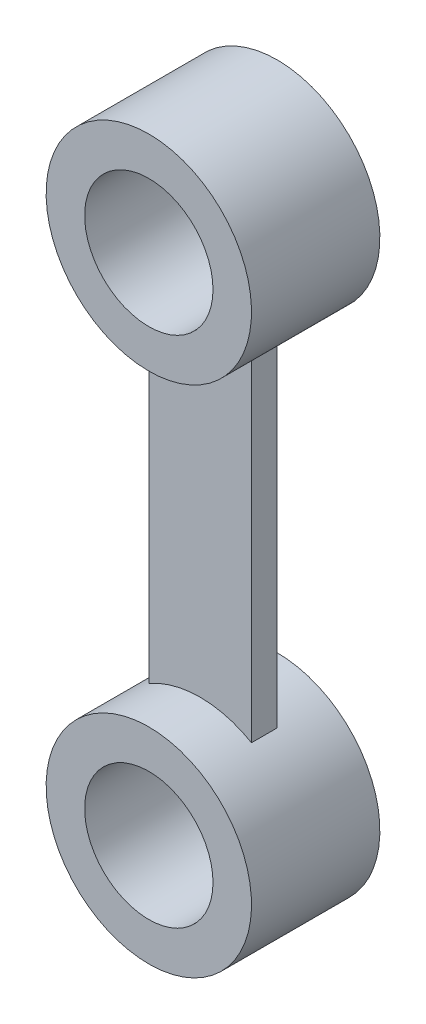
ISO-10303-21;
HEADER;
FILE_DESCRIPTION(('STEP AP214'),'2;1');
FILE_NAME('part.step','',(''),(''),'','','');
FILE_SCHEMA(('AUTOMOTIVE_DESIGN { 1 0 10303 214 1 1 1 1 }'));
ENDSEC;
DATA;
#1=APPLICATION_CONTEXT('core data for automotive mechanical design processes');
#2=APPLICATION_PROTOCOL_DEFINITION('international standard','automotive_design',2000,#1);
#3=PRODUCT_CONTEXT('',#1,'mechanical');
#4=PRODUCT('Part','Part','',(#3));
#5=PRODUCT_RELATED_PRODUCT_CATEGORY('part','',(#4));
#6=PRODUCT_DEFINITION_FORMATION('','',#4);
#7=PRODUCT_DEFINITION_CONTEXT('part definition',#1,'design');
#8=PRODUCT_DEFINITION('design','',#6,#7);
#9=PRODUCT_DEFINITION_SHAPE('','',#8);
#10=(LENGTH_UNIT() NAMED_UNIT(*) SI_UNIT(.MILLI.,.METRE.));
#11=(NAMED_UNIT(*) PLANE_ANGLE_UNIT() SI_UNIT($,.RADIAN.));
#12=(NAMED_UNIT(*) SI_UNIT($,.STERADIAN.) SOLID_ANGLE_UNIT());
#13=UNCERTAINTY_MEASURE_WITH_UNIT(LENGTH_MEASURE(1.E-05),#10,'distance_accuracy_value','');
#14=(GEOMETRIC_REPRESENTATION_CONTEXT(3) GLOBAL_UNCERTAINTY_ASSIGNED_CONTEXT((#13)) GLOBAL_UNIT_ASSIGNED_CONTEXT((#10,
#11,#12)) REPRESENTATION_CONTEXT('',''));
#15=CARTESIAN_POINT('',(0.,0.,0.));
#16=DIRECTION('',(0.,0.,1.));
#17=DIRECTION('',(1.,0.,0.));
#18=AXIS2_PLACEMENT_3D('',#15,#16,#17);
#19=CARTESIAN_POINT('',(0.,10.,-2.5));
#20=DIRECTION('',(0.,0.,1.));
#21=DIRECTION('',(1.,0.,0.));
#22=AXIS2_PLACEMENT_3D('',#19,#20,#21);
#23=PLANE('',#22);
#24=CARTESIAN_POINT('',(0.,0.,-2.5));
#25=DIRECTION('',(0.,0.,1.));
#26=DIRECTION('',(-1.,0.,0.));
#27=AXIS2_PLACEMENT_3D('',#24,#25,#26);
#28=CIRCLE('',#27,2.5);
#29=CARTESIAN_POINT('',(2.5,0.,-2.5));
#30=VERTEX_POINT('',#29);
#31=EDGE_CURVE('E26',#30,#30,#28,.T.);
#32=ORIENTED_EDGE('',*,*,#31,.T.);
#33=EDGE_LOOP('',(#32));
#34=FACE_BOUND('',#33,.T.);
#35=CARTESIAN_POINT('',(0.,0.,-2.5));
#36=DIRECTION('',(0.,0.,1.));
#37=DIRECTION('',(1.,0.,0.));
#38=AXIS2_PLACEMENT_3D('',#35,#36,#37);
#39=CIRCLE('',#38,4.);
#40=CARTESIAN_POINT('',(2.,3.46410161513775,-2.5));
#41=VERTEX_POINT('',#40);
#42=EDGE_CURVE('E10',#41,#41,#39,.T.);
#43=ORIENTED_EDGE('',*,*,#42,.F.);
#44=EDGE_LOOP('',(#43));
#45=FACE_BOUND('',#44,.T.);
#46=ADVANCED_FACE('F16',(#34,#45),#23,.F.);
#47=CARTESIAN_POINT('',(0.,20.,0.));
#48=DIRECTION('',(0.,0.,1.));
#49=DIRECTION('',(1.,0.,0.));
#50=AXIS2_PLACEMENT_3D('',#47,#48,#49);
#51=CYLINDRICAL_SURFACE('',#50,4.);
#52=CARTESIAN_POINT('',(0.,20.,2.5));
#53=DIRECTION('',(0.,0.,-1.));
#54=DIRECTION('',(1.,0.,0.));
#55=AXIS2_PLACEMENT_3D('',#52,#53,#54);
#56=CIRCLE('',#55,4.);
#57=CARTESIAN_POINT('',(2.,16.5358983848623,2.5));
#58=VERTEX_POINT('',#57);
#59=EDGE_CURVE('E147',#58,#58,#56,.T.);
#60=ORIENTED_EDGE('',*,*,#59,.T.);
#61=EDGE_LOOP('',(#60));
#62=FACE_BOUND('',#61,.T.);
#63=CARTESIAN_POINT('',(0.,20.,-0.5));
#64=DIRECTION('',(0.,0.,1.));
#65=DIRECTION('',(-1.,0.,0.));
#66=AXIS2_PLACEMENT_3D('',#63,#64,#65);
#67=CIRCLE('',#66,4.);
#68=CARTESIAN_POINT('',(-2.,16.5358983848623,-0.5));
#69=VERTEX_POINT('',#68);
#70=CARTESIAN_POINT('',(2.,16.5358983848623,-0.5));
#71=VERTEX_POINT('',#70);
#72=EDGE_CURVE('E141',#69,#71,#67,.T.);
#73=ORIENTED_EDGE('',*,*,#72,.F.);
#74=DIRECTION('',(0.,0.,-1.));
#75=VECTOR('',#74,1.);
#76=CARTESIAN_POINT('',(-2.,16.5358983848623,0.5));
#77=LINE('',#76,#75);
#78=CARTESIAN_POINT('',(-2.,16.5358983848623,0.5));
#79=VERTEX_POINT('',#78);
#80=EDGE_CURVE('E144',#79,#69,#77,.T.);
#81=ORIENTED_EDGE('',*,*,#80,.F.);
#82=CARTESIAN_POINT('',(0.,20.,0.5));
#83=DIRECTION('',(0.,0.,1.));
#84=DIRECTION('',(-1.,0.,0.));
#85=AXIS2_PLACEMENT_3D('',#82,#83,#84);
#86=CIRCLE('',#85,4.);
#87=CARTESIAN_POINT('',(2.,16.5358983848623,0.5));
#88=VERTEX_POINT('',#87);
#89=EDGE_CURVE('E19',#79,#88,#86,.T.);
#90=ORIENTED_EDGE('',*,*,#89,.T.);
#91=DIRECTION('',(0.,0.,1.));
#92=VECTOR('',#91,1.);
#93=CARTESIAN_POINT('',(2.,16.5358983848623,-0.5));
#94=LINE('',#93,#92);
#95=EDGE_CURVE('E129',#71,#88,#94,.T.);
#96=ORIENTED_EDGE('',*,*,#95,.F.);
#97=EDGE_LOOP('',(#73,#81,#90,#96));
#98=FACE_BOUND('',#97,.T.);
#99=CARTESIAN_POINT('',(0.,20.,-2.5));
#100=DIRECTION('',(0.,0.,-1.));
#101=DIRECTION('',(-1.,0.,0.));
#102=AXIS2_PLACEMENT_3D('',#99,#100,#101);
#103=CIRCLE('',#102,4.);
#104=CARTESIAN_POINT('',(2.,16.5358983848623,-2.5));
#105=VERTEX_POINT('',#104);
#106=EDGE_CURVE('E126',#105,#105,#103,.T.);
#107=ORIENTED_EDGE('',*,*,#106,.F.);
#108=EDGE_LOOP('',(#107));
#109=FACE_BOUND('',#108,.T.);
#110=ADVANCED_FACE('F229',(#62,#98,#109),#51,.T.);
#111=CARTESIAN_POINT('',(0.,0.,0.));
#112=DIRECTION('',(0.,0.,1.));
#113=DIRECTION('',(1.,0.,0.));
#114=AXIS2_PLACEMENT_3D('',#111,#112,#113);
#115=CYLINDRICAL_SURFACE('',#114,4.);
#116=ORIENTED_EDGE('',*,*,#42,.T.);
#117=EDGE_LOOP('',(#116));
#118=FACE_BOUND('',#117,.T.);
#119=DIRECTION('',(0.,0.,1.));
#120=VECTOR('',#119,1.);
#121=CARTESIAN_POINT('',(2.,3.46410161513775,-0.5));
#122=LINE('',#121,#120);
#123=CARTESIAN_POINT('',(2.,3.46410161513775,-0.5));
#124=VERTEX_POINT('',#123);
#125=CARTESIAN_POINT('',(2.,3.46410161513775,0.5));
#126=VERTEX_POINT('',#125);
#127=EDGE_CURVE('E117',#124,#126,#122,.T.);
#128=ORIENTED_EDGE('',*,*,#127,.T.);
#129=CARTESIAN_POINT('',(0.,0.,0.5));
#130=DIRECTION('',(0.,0.,1.));
#131=DIRECTION('',(-1.,0.,0.));
#132=AXIS2_PLACEMENT_3D('',#129,#130,#131);
#133=CIRCLE('',#132,4.);
#134=CARTESIAN_POINT('',(-2.,3.46410161513775,0.5));
#135=VERTEX_POINT('',#134);
#136=EDGE_CURVE('E102',#126,#135,#133,.T.);
#137=ORIENTED_EDGE('',*,*,#136,.T.);
#138=DIRECTION('',(0.,0.,1.));
#139=VECTOR('',#138,1.);
#140=CARTESIAN_POINT('',(-2.,3.46410161513775,-0.5));
#141=LINE('',#140,#139);
#142=CARTESIAN_POINT('',(-2.,3.46410161513775,-0.5));
#143=VERTEX_POINT('',#142);
#144=EDGE_CURVE('E113',#143,#135,#141,.T.);
#145=ORIENTED_EDGE('',*,*,#144,.F.);
#146=CARTESIAN_POINT('',(0.,0.,-0.5));
#147=DIRECTION('',(0.,0.,1.));
#148=DIRECTION('',(-1.,0.,0.));
#149=AXIS2_PLACEMENT_3D('',#146,#147,#148);
#150=CIRCLE('',#149,4.);
#151=EDGE_CURVE('E121',#124,#143,#150,.T.);
#152=ORIENTED_EDGE('',*,*,#151,.F.);
#153=EDGE_LOOP('',(#128,#137,#145,#152));
#154=FACE_BOUND('',#153,.T.);
#155=CARTESIAN_POINT('',(0.,0.,2.5));
#156=DIRECTION('',(0.,0.,1.));
#157=DIRECTION('',(-1.,0.,0.));
#158=AXIS2_PLACEMENT_3D('',#155,#156,#157);
#159=CIRCLE('',#158,4.);
#160=CARTESIAN_POINT('',(2.,3.46410161513775,2.5));
#161=VERTEX_POINT('',#160);
#162=EDGE_CURVE('E75',#161,#161,#159,.T.);
#163=ORIENTED_EDGE('',*,*,#162,.F.);
#164=EDGE_LOOP('',(#163));
#165=FACE_BOUND('',#164,.T.);
#166=ADVANCED_FACE('F118',(#118,#154,#165),#115,.T.);
#167=CARTESIAN_POINT('',(0.,20.,0.));
#168=DIRECTION('',(0.,0.,1.));
#169=DIRECTION('',(-1.,0.,0.));
#170=AXIS2_PLACEMENT_3D('',#167,#168,#169);
#171=CYLINDRICAL_SURFACE('',#170,2.5);
#172=CARTESIAN_POINT('',(0.,20.,2.5));
#173=DIRECTION('',(0.,0.,-1.));
#174=DIRECTION('',(-1.,0.,0.));
#175=AXIS2_PLACEMENT_3D('',#172,#173,#174);
#176=CIRCLE('',#175,2.5);
#177=CARTESIAN_POINT('',(2.5,20.,2.5));
#178=VERTEX_POINT('',#177);
#179=EDGE_CURVE('E156',#178,#178,#176,.T.);
#180=ORIENTED_EDGE('',*,*,#179,.F.);
#181=EDGE_LOOP('',(#180));
#182=FACE_BOUND('',#181,.T.);
#183=CARTESIAN_POINT('',(0.,20.,-2.5));
#184=DIRECTION('',(0.,0.,1.));
#185=DIRECTION('',(-1.,0.,0.));
#186=AXIS2_PLACEMENT_3D('',#183,#184,#185);
#187=CIRCLE('',#186,2.5);
#188=CARTESIAN_POINT('',(2.5,20.,-2.5));
#189=VERTEX_POINT('',#188);
#190=EDGE_CURVE('E153',#189,#189,#187,.T.);
#191=ORIENTED_EDGE('',*,*,#190,.F.);
#192=EDGE_LOOP('',(#191));
#193=FACE_BOUND('',#192,.T.);
#194=ADVANCED_FACE('F244',(#182,#193),#171,.F.);
#195=CARTESIAN_POINT('',(0.,0.,0.));
#196=DIRECTION('',(0.,0.,1.));
#197=DIRECTION('',(-1.,0.,0.));
#198=AXIS2_PLACEMENT_3D('',#195,#196,#197);
#199=CYLINDRICAL_SURFACE('',#198,2.5);
#200=CARTESIAN_POINT('',(0.,0.,2.5));
#201=DIRECTION('',(0.,0.,-1.));
#202=DIRECTION('',(-1.,0.,0.));
#203=AXIS2_PLACEMENT_3D('',#200,#201,#202);
#204=CIRCLE('',#203,2.5);
#205=CARTESIAN_POINT('',(2.5,0.,2.5));
#206=VERTEX_POINT('',#205);
#207=EDGE_CURVE('E84',#206,#206,#204,.T.);
#208=ORIENTED_EDGE('',*,*,#207,.F.);
#209=EDGE_LOOP('',(#208));
#210=FACE_BOUND('',#209,.T.);
#211=ORIENTED_EDGE('',*,*,#31,.F.);
#212=EDGE_LOOP('',(#211));
#213=FACE_BOUND('',#212,.T.);
#214=ADVANCED_FACE('F277',(#210,#213),#199,.F.);
#215=CARTESIAN_POINT('',(0.,10.,2.5));
#216=DIRECTION('',(0.,0.,1.));
#217=DIRECTION('',(1.,0.,0.));
#218=AXIS2_PLACEMENT_3D('',#215,#216,#217);
#219=PLANE('',#218);
#220=ORIENTED_EDGE('',*,*,#207,.T.);
#221=EDGE_LOOP('',(#220));
#222=FACE_BOUND('',#221,.T.);
#223=ORIENTED_EDGE('',*,*,#162,.T.);
#224=EDGE_LOOP('',(#223));
#225=FACE_BOUND('',#224,.T.);
#226=ADVANCED_FACE('F287',(#222,#225),#219,.T.);
#227=CARTESIAN_POINT('',(0.,10.,2.5));
#228=DIRECTION('',(0.,0.,1.));
#229=DIRECTION('',(1.,0.,0.));
#230=AXIS2_PLACEMENT_3D('',#227,#228,#229);
#231=PLANE('',#230);
#232=ORIENTED_EDGE('',*,*,#179,.T.);
#233=EDGE_LOOP('',(#232));
#234=FACE_BOUND('',#233,.T.);
#235=ORIENTED_EDGE('',*,*,#59,.F.);
#236=EDGE_LOOP('',(#235));
#237=FACE_BOUND('',#236,.T.);
#238=ADVANCED_FACE('F283',(#234,#237),#231,.T.);
#239=CARTESIAN_POINT('',(-2.,3.46410161513775,0.));
#240=DIRECTION('',(-1.,0.,0.));
#241=DIRECTION('',(0.,0.,1.));
#242=AXIS2_PLACEMENT_3D('',#239,#240,#241);
#243=PLANE('',#242);
#244=DIRECTION('',(0.,-1.,0.));
#245=VECTOR('',#244,1.);
#246=CARTESIAN_POINT('',(-2.,16.5358983848623,-0.5));
#247=LINE('',#246,#245);
#248=EDGE_CURVE('E135',#69,#143,#247,.T.);
#249=ORIENTED_EDGE('',*,*,#248,.T.);
#250=ORIENTED_EDGE('',*,*,#144,.T.);
#251=DIRECTION('',(0.,1.,0.));
#252=VECTOR('',#251,1.);
#253=CARTESIAN_POINT('',(-2.,3.46410161513775,0.5));
#254=LINE('',#253,#252);
#255=EDGE_CURVE('E110',#135,#79,#254,.T.);
#256=ORIENTED_EDGE('',*,*,#255,.T.);
#257=ORIENTED_EDGE('',*,*,#80,.T.);
#258=EDGE_LOOP('',(#249,#250,#256,#257));
#259=FACE_BOUND('',#258,.T.);
#260=ADVANCED_FACE('F253',(#259),#243,.T.);
#261=CARTESIAN_POINT('',(0.,10.,0.5));
#262=DIRECTION('',(0.,0.,1.));
#263=DIRECTION('',(1.,0.,0.));
#264=AXIS2_PLACEMENT_3D('',#261,#262,#263);
#265=PLANE('',#264);
#266=ORIENTED_EDGE('',*,*,#89,.F.);
#267=ORIENTED_EDGE('',*,*,#255,.F.);
#268=ORIENTED_EDGE('',*,*,#136,.F.);
#269=DIRECTION('',(0.,-1.,0.));
#270=VECTOR('',#269,1.);
#271=CARTESIAN_POINT('',(2.,16.5358983848623,0.5));
#272=LINE('',#271,#270);
#273=EDGE_CURVE('E107',#88,#126,#272,.T.);
#274=ORIENTED_EDGE('',*,*,#273,.F.);
#275=EDGE_LOOP('',(#266,#267,#268,#274));
#276=FACE_BOUND('',#275,.T.);
#277=ADVANCED_FACE('F105',(#276),#265,.T.);
#278=CARTESIAN_POINT('',(0.,10.,-2.5));
#279=DIRECTION('',(0.,0.,1.));
#280=DIRECTION('',(1.,0.,0.));
#281=AXIS2_PLACEMENT_3D('',#278,#279,#280);
#282=PLANE('',#281);
#283=ORIENTED_EDGE('',*,*,#190,.T.);
#284=EDGE_LOOP('',(#283));
#285=FACE_BOUND('',#284,.T.);
#286=ORIENTED_EDGE('',*,*,#106,.T.);
#287=EDGE_LOOP('',(#286));
#288=FACE_BOUND('',#287,.T.);
#289=ADVANCED_FACE('F252',(#285,#288),#282,.F.);
#290=CARTESIAN_POINT('',(2.,16.5358983848623,0.));
#291=DIRECTION('',(1.,0.,0.));
#292=DIRECTION('',(0.,1.,0.));
#293=AXIS2_PLACEMENT_3D('',#290,#291,#292);
#294=PLANE('',#293);
#295=DIRECTION('',(0.,1.,0.));
#296=VECTOR('',#295,1.);
#297=CARTESIAN_POINT('',(2.,3.46410161513775,-0.5));
#298=LINE('',#297,#296);
#299=EDGE_CURVE('E138',#124,#71,#298,.T.);
#300=ORIENTED_EDGE('',*,*,#299,.T.);
#301=ORIENTED_EDGE('',*,*,#95,.T.);
#302=ORIENTED_EDGE('',*,*,#273,.T.);
#303=ORIENTED_EDGE('',*,*,#127,.F.);
#304=EDGE_LOOP('',(#300,#301,#302,#303));
#305=FACE_BOUND('',#304,.T.);
#306=ADVANCED_FACE('F128',(#305),#294,.T.);
#307=CARTESIAN_POINT('',(-2.,16.5358983848623,-0.5));
#308=CARTESIAN_POINT('',(-2.,3.46410161513775,-0.5));
#309=CARTESIAN_POINT('',(2.,16.5358983848623,-0.5));
#310=CARTESIAN_POINT('',(2.,3.46410161513775,-0.5));
#311=(BOUNDED_SURFACE() B_SPLINE_SURFACE(1,1,((#307,#308),(#309,#310)),.UNSPECIFIED.,.F.,.F.,
.F.) B_SPLINE_SURFACE_WITH_KNOTS((2,2),(2,2),(0.,4.),(0.,13.0717967697245),
.UNSPECIFIED.) GEOMETRIC_REPRESENTATION_ITEM() RATIONAL_B_SPLINE_SURFACE(((1.,1.),(1.,1.))) REPRESENTATION_ITEM('') SURFACE());
#312=ORIENTED_EDGE('',*,*,#72,.T.);
#313=ORIENTED_EDGE('',*,*,#299,.F.);
#314=ORIENTED_EDGE('',*,*,#151,.T.);
#315=ORIENTED_EDGE('',*,*,#248,.F.);
#316=EDGE_LOOP('',(#312,#313,#314,#315));
#317=FACE_BOUND('',#316,.T.);
#318=ADVANCED_FACE('F261',(#317),#311,.T.);
#319=CLOSED_SHELL('',(#46,#110,#166,#194,#214,#226,#238,#260,#277,#289,#306,#318));
#320=MANIFOLD_SOLID_BREP('B1',#319);
#321=ADVANCED_BREP_SHAPE_REPRESENTATION('',(#18,#320),#14);
#322=SHAPE_DEFINITION_REPRESENTATION(#9,#321);
ENDSEC;
END-ISO-10303-21;
